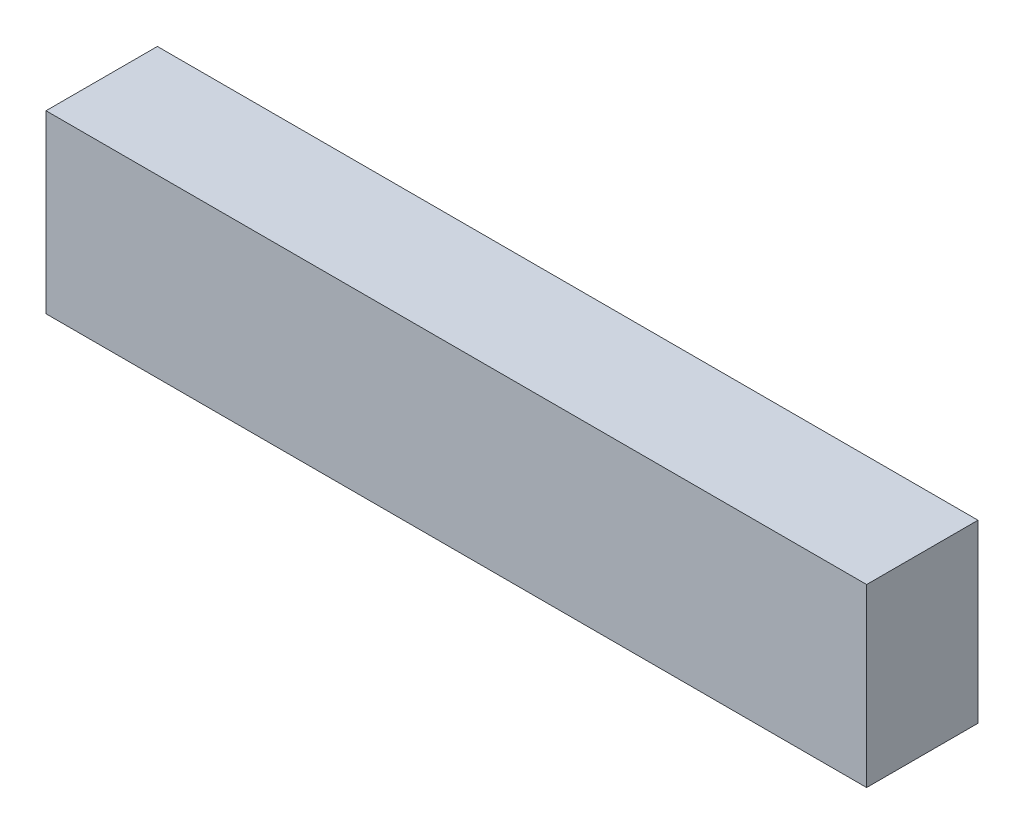
ISO-10303-21;
HEADER;
FILE_DESCRIPTION(('STEP AP214'),'2;1');
FILE_NAME('part.step','',(''),(''),'','','');
FILE_SCHEMA(('AUTOMOTIVE_DESIGN { 1 0 10303 214 1 1 1 1 }'));
ENDSEC;
DATA;
#1=APPLICATION_CONTEXT('core data for automotive mechanical design processes');
#2=APPLICATION_PROTOCOL_DEFINITION('international standard','automotive_design',2000,#1);
#3=PRODUCT_CONTEXT('',#1,'mechanical');
#4=PRODUCT('Part','Part','',(#3));
#5=PRODUCT_RELATED_PRODUCT_CATEGORY('part','',(#4));
#6=PRODUCT_DEFINITION_FORMATION('','',#4);
#7=PRODUCT_DEFINITION_CONTEXT('part definition',#1,'design');
#8=PRODUCT_DEFINITION('design','',#6,#7);
#9=PRODUCT_DEFINITION_SHAPE('','',#8);
#10=(LENGTH_UNIT() NAMED_UNIT(*) SI_UNIT(.MILLI.,.METRE.));
#11=(NAMED_UNIT(*) PLANE_ANGLE_UNIT() SI_UNIT($,.RADIAN.));
#12=(NAMED_UNIT(*) SI_UNIT($,.STERADIAN.) SOLID_ANGLE_UNIT());
#13=UNCERTAINTY_MEASURE_WITH_UNIT(LENGTH_MEASURE(1.E-05),#10,'distance_accuracy_value','');
#14=(GEOMETRIC_REPRESENTATION_CONTEXT(3) GLOBAL_UNCERTAINTY_ASSIGNED_CONTEXT((#13)) GLOBAL_UNIT_ASSIGNED_CONTEXT((#10,
#11,#12)) REPRESENTATION_CONTEXT('',''));
#15=CARTESIAN_POINT('',(0.,0.,0.));
#16=DIRECTION('',(0.,0.,1.));
#17=DIRECTION('',(1.,0.,0.));
#18=AXIS2_PLACEMENT_3D('',#15,#16,#17);
#19=CARTESIAN_POINT('',(70.,15.,19.));
#20=DIRECTION('',(0.,-1.,0.));
#21=DIRECTION('',(0.,0.,-1.));
#22=AXIS2_PLACEMENT_3D('',#19,#20,#21);
#23=PLANE('',#22);
#24=DIRECTION('',(-1.,0.,0.));
#25=VECTOR('',#24,1.);
#26=CARTESIAN_POINT('',(70.,15.,0.));
#27=LINE('',#26,#25);
#28=CARTESIAN_POINT('',(70.,15.,0.));
#29=VERTEX_POINT('',#28);
#30=CARTESIAN_POINT('',(-70.,15.,0.));
#31=VERTEX_POINT('',#30);
#32=EDGE_CURVE('E113',#29,#31,#27,.T.);
#33=ORIENTED_EDGE('',*,*,#32,.T.);
#34=DIRECTION('',(0.,0.,-1.));
#35=VECTOR('',#34,1.);
#36=CARTESIAN_POINT('',(-70.,15.,19.));
#37=LINE('',#36,#35);
#38=CARTESIAN_POINT('',(-70.,15.,19.));
#39=VERTEX_POINT('',#38);
#40=EDGE_CURVE('E11',#39,#31,#37,.T.);
#41=ORIENTED_EDGE('',*,*,#40,.F.);
#42=DIRECTION('',(-1.,0.,0.));
#43=VECTOR('',#42,1.);
#44=CARTESIAN_POINT('',(70.,15.,19.));
#45=LINE('',#44,#43);
#46=CARTESIAN_POINT('',(70.,15.,19.));
#47=VERTEX_POINT('',#46);
#48=EDGE_CURVE('E97',#47,#39,#45,.T.);
#49=ORIENTED_EDGE('',*,*,#48,.F.);
#50=DIRECTION('',(0.,0.,-1.));
#51=VECTOR('',#50,1.);
#52=CARTESIAN_POINT('',(70.,15.,19.));
#53=LINE('',#52,#51);
#54=EDGE_CURVE('E109',#47,#29,#53,.T.);
#55=ORIENTED_EDGE('',*,*,#54,.T.);
#56=EDGE_LOOP('',(#33,#41,#49,#55));
#57=FACE_BOUND('',#56,.T.);
#58=ADVANCED_FACE('F45',(#57),#23,.F.);
#59=CARTESIAN_POINT('',(-70.,-15.,19.));
#60=DIRECTION('',(1.,0.,0.));
#61=DIRECTION('',(0.,0.,-1.));
#62=AXIS2_PLACEMENT_3D('',#59,#60,#61);
#63=PLANE('',#62);
#64=DIRECTION('',(0.,-1.,0.));
#65=VECTOR('',#64,1.);
#66=CARTESIAN_POINT('',(-70.,-15.,0.));
#67=LINE('',#66,#65);
#68=CARTESIAN_POINT('',(-70.,-15.,0.));
#69=VERTEX_POINT('',#68);
#70=EDGE_CURVE('E102',#31,#69,#67,.T.);
#71=ORIENTED_EDGE('',*,*,#70,.T.);
#72=DIRECTION('',(0.,0.,-1.));
#73=VECTOR('',#72,1.);
#74=CARTESIAN_POINT('',(-70.,-15.,19.));
#75=LINE('',#74,#73);
#76=CARTESIAN_POINT('',(-70.,-15.,19.));
#77=VERTEX_POINT('',#76);
#78=EDGE_CURVE('E54',#77,#69,#75,.T.);
#79=ORIENTED_EDGE('',*,*,#78,.F.);
#80=DIRECTION('',(0.,-1.,0.));
#81=VECTOR('',#80,1.);
#82=CARTESIAN_POINT('',(-70.,-15.,19.));
#83=LINE('',#82,#81);
#84=EDGE_CURVE('E92',#39,#77,#83,.T.);
#85=ORIENTED_EDGE('',*,*,#84,.F.);
#86=ORIENTED_EDGE('',*,*,#40,.T.);
#87=EDGE_LOOP('',(#71,#79,#85,#86));
#88=FACE_BOUND('',#87,.T.);
#89=ADVANCED_FACE('F101',(#88),#63,.F.);
#90=CARTESIAN_POINT('',(70.,-15.,19.));
#91=DIRECTION('',(0.,1.,0.));
#92=DIRECTION('',(0.,0.,1.));
#93=AXIS2_PLACEMENT_3D('',#90,#91,#92);
#94=PLANE('',#93);
#95=DIRECTION('',(1.,0.,0.));
#96=VECTOR('',#95,1.);
#97=CARTESIAN_POINT('',(70.,-15.,0.));
#98=LINE('',#97,#96);
#99=CARTESIAN_POINT('',(70.,-15.,0.));
#100=VERTEX_POINT('',#99);
#101=EDGE_CURVE('E79',#69,#100,#98,.T.);
#102=ORIENTED_EDGE('',*,*,#101,.T.);
#103=DIRECTION('',(0.,0.,-1.));
#104=VECTOR('',#103,1.);
#105=CARTESIAN_POINT('',(70.,-15.,19.));
#106=LINE('',#105,#104);
#107=CARTESIAN_POINT('',(70.,-15.,19.));
#108=VERTEX_POINT('',#107);
#109=EDGE_CURVE('E104',#108,#100,#106,.T.);
#110=ORIENTED_EDGE('',*,*,#109,.F.);
#111=DIRECTION('',(1.,0.,0.));
#112=VECTOR('',#111,1.);
#113=CARTESIAN_POINT('',(70.,-15.,19.));
#114=LINE('',#113,#112);
#115=EDGE_CURVE('E95',#77,#108,#114,.T.);
#116=ORIENTED_EDGE('',*,*,#115,.F.);
#117=ORIENTED_EDGE('',*,*,#78,.T.);
#118=EDGE_LOOP('',(#102,#110,#116,#117));
#119=FACE_BOUND('',#118,.T.);
#120=ADVANCED_FACE('F105',(#119),#94,.F.);
#121=CARTESIAN_POINT('',(70.,-15.,19.));
#122=DIRECTION('',(-1.,0.,0.));
#123=DIRECTION('',(0.,0.,1.));
#124=AXIS2_PLACEMENT_3D('',#121,#122,#123);
#125=PLANE('',#124);
#126=DIRECTION('',(0.,1.,0.));
#127=VECTOR('',#126,1.);
#128=CARTESIAN_POINT('',(70.,-15.,0.));
#129=LINE('',#128,#127);
#130=EDGE_CURVE('E85',#100,#29,#129,.T.);
#131=ORIENTED_EDGE('',*,*,#130,.T.);
#132=ORIENTED_EDGE('',*,*,#54,.F.);
#133=DIRECTION('',(0.,1.,0.));
#134=VECTOR('',#133,1.);
#135=CARTESIAN_POINT('',(70.,-15.,19.));
#136=LINE('',#135,#134);
#137=EDGE_CURVE('E62',#108,#47,#136,.T.);
#138=ORIENTED_EDGE('',*,*,#137,.F.);
#139=ORIENTED_EDGE('',*,*,#109,.T.);
#140=EDGE_LOOP('',(#131,#132,#138,#139));
#141=FACE_BOUND('',#140,.T.);
#142=ADVANCED_FACE('F126',(#141),#125,.F.);
#143=CARTESIAN_POINT('',(0.,0.,19.));
#144=DIRECTION('',(0.,0.,-1.));
#145=DIRECTION('',(-1.,0.,0.));
#146=AXIS2_PLACEMENT_3D('',#143,#144,#145);
#147=PLANE('',#146);
#148=ORIENTED_EDGE('',*,*,#48,.T.);
#149=ORIENTED_EDGE('',*,*,#84,.T.);
#150=ORIENTED_EDGE('',*,*,#115,.T.);
#151=ORIENTED_EDGE('',*,*,#137,.T.);
#152=EDGE_LOOP('',(#148,#149,#150,#151));
#153=FACE_BOUND('',#152,.T.);
#154=ADVANCED_FACE('F93',(#153),#147,.F.);
#155=CARTESIAN_POINT('',(0.,0.,0.));
#156=DIRECTION('',(0.,0.,-1.));
#157=DIRECTION('',(-1.,0.,0.));
#158=AXIS2_PLACEMENT_3D('',#155,#156,#157);
#159=PLANE('',#158);
#160=ORIENTED_EDGE('',*,*,#32,.F.);
#161=ORIENTED_EDGE('',*,*,#130,.F.);
#162=ORIENTED_EDGE('',*,*,#101,.F.);
#163=ORIENTED_EDGE('',*,*,#70,.F.);
#164=EDGE_LOOP('',(#160,#161,#162,#163));
#165=FACE_BOUND('',#164,.T.);
#166=ADVANCED_FACE('F129',(#165),#159,.T.);
#167=CLOSED_SHELL('',(#58,#89,#120,#142,#154,#166));
#168=MANIFOLD_SOLID_BREP('B2',#167);
#169=ADVANCED_BREP_SHAPE_REPRESENTATION('',(#18,#168),#14);
#170=SHAPE_DEFINITION_REPRESENTATION(#9,#169);
ENDSEC;
END-ISO-10303-21;
